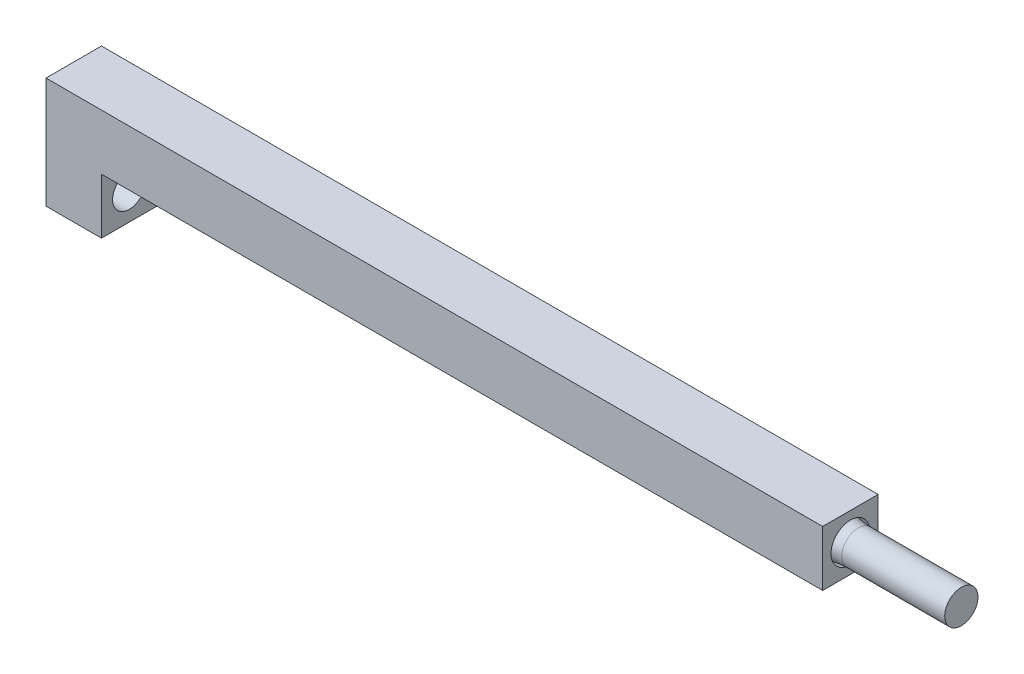
ISO-10303-21;
HEADER;
FILE_DESCRIPTION(('STEP AP214'),'2;1');
FILE_NAME('part.step','',(''),(''),'','','');
FILE_SCHEMA(('AUTOMOTIVE_DESIGN { 1 0 10303 214 1 1 1 1 }'));
ENDSEC;
DATA;
#1=APPLICATION_CONTEXT('core data for automotive mechanical design processes');
#2=APPLICATION_PROTOCOL_DEFINITION('international standard','automotive_design',2000,#1);
#3=PRODUCT_CONTEXT('',#1,'mechanical');
#4=PRODUCT('Part','Part','',(#3));
#5=PRODUCT_RELATED_PRODUCT_CATEGORY('part','',(#4));
#6=PRODUCT_DEFINITION_FORMATION('','',#4);
#7=PRODUCT_DEFINITION_CONTEXT('part definition',#1,'design');
#8=PRODUCT_DEFINITION('design','',#6,#7);
#9=PRODUCT_DEFINITION_SHAPE('','',#8);
#10=(LENGTH_UNIT() NAMED_UNIT(*) SI_UNIT(.MILLI.,.METRE.));
#11=(NAMED_UNIT(*) PLANE_ANGLE_UNIT() SI_UNIT($,.RADIAN.));
#12=(NAMED_UNIT(*) SI_UNIT($,.STERADIAN.) SOLID_ANGLE_UNIT());
#13=UNCERTAINTY_MEASURE_WITH_UNIT(LENGTH_MEASURE(1.E-05),#10,'distance_accuracy_value','');
#14=(GEOMETRIC_REPRESENTATION_CONTEXT(3) GLOBAL_UNCERTAINTY_ASSIGNED_CONTEXT((#13)) GLOBAL_UNIT_ASSIGNED_CONTEXT((#10,
#11,#12)) REPRESENTATION_CONTEXT('',''));
#15=CARTESIAN_POINT('',(0.,0.,0.));
#16=DIRECTION('',(0.,0.,1.));
#17=DIRECTION('',(1.,0.,0.));
#18=AXIS2_PLACEMENT_3D('',#15,#16,#17);
#19=CARTESIAN_POINT('',(-140.,10.,10.));
#20=DIRECTION('',(1.,0.,0.));
#21=DIRECTION('',(0.,1.,0.));
#22=AXIS2_PLACEMENT_3D('',#19,#20,#21);
#23=PLANE('',#22);
#24=CARTESIAN_POINT('',(-140.,-5.,5.));
#25=DIRECTION('',(1.,0.,0.));
#26=DIRECTION('',(0.,1.,0.));
#27=AXIS2_PLACEMENT_3D('',#24,#25,#26);
#28=CIRCLE('',#27,3.);
#29=CARTESIAN_POINT('',(-140.,-2.,5.));
#30=VERTEX_POINT('',#29);
#31=EDGE_CURVE('E137',#30,#30,#28,.T.);
#32=ORIENTED_EDGE('',*,*,#31,.T.);
#33=EDGE_LOOP('',(#32));
#34=FACE_BOUND('',#33,.T.);
#35=DIRECTION('',(0.,-1.,0.));
#36=VECTOR('',#35,1.);
#37=CARTESIAN_POINT('',(-140.,10.,0.));
#38=LINE('',#37,#36);
#39=CARTESIAN_POINT('',(-140.,10.,0.));
#40=VERTEX_POINT('',#39);
#41=CARTESIAN_POINT('',(-140.,-10.,0.));
#42=VERTEX_POINT('',#41);
#43=EDGE_CURVE('E132',#40,#42,#38,.T.);
#44=ORIENTED_EDGE('',*,*,#43,.T.);
#45=DIRECTION('',(0.,0.,-1.));
#46=VECTOR('',#45,1.);
#47=CARTESIAN_POINT('',(-140.,-10.,10.));
#48=LINE('',#47,#46);
#49=CARTESIAN_POINT('',(-140.,-10.,10.));
#50=VERTEX_POINT('',#49);
#51=EDGE_CURVE('E51',#50,#42,#48,.T.);
#52=ORIENTED_EDGE('',*,*,#51,.F.);
#53=DIRECTION('',(0.,-1.,0.));
#54=VECTOR('',#53,1.);
#55=CARTESIAN_POINT('',(-140.,10.,10.));
#56=LINE('',#55,#54);
#57=CARTESIAN_POINT('',(-140.,10.,10.));
#58=VERTEX_POINT('',#57);
#59=EDGE_CURVE('E149',#58,#50,#56,.T.);
#60=ORIENTED_EDGE('',*,*,#59,.F.);
#61=DIRECTION('',(0.,0.,-1.));
#62=VECTOR('',#61,1.);
#63=CARTESIAN_POINT('',(-140.,10.,10.));
#64=LINE('',#63,#62);
#65=EDGE_CURVE('E128',#58,#40,#64,.T.);
#66=ORIENTED_EDGE('',*,*,#65,.T.);
#67=EDGE_LOOP('',(#44,#52,#60,#66));
#68=FACE_BOUND('',#67,.T.);
#69=ADVANCED_FACE('F41',(#34,#68),#23,.F.);
#70=CARTESIAN_POINT('',(-140.,-10.,10.));
#71=DIRECTION('',(0.,1.,0.));
#72=DIRECTION('',(-1.,0.,0.));
#73=AXIS2_PLACEMENT_3D('',#70,#71,#72);
#74=PLANE('',#73);
#75=DIRECTION('',(1.,0.,0.));
#76=VECTOR('',#75,1.);
#77=CARTESIAN_POINT('',(-140.,-10.,0.));
#78=LINE('',#77,#76);
#79=CARTESIAN_POINT('',(-130.,-10.,0.));
#80=VERTEX_POINT('',#79);
#81=EDGE_CURVE('E136',#42,#80,#78,.T.);
#82=ORIENTED_EDGE('',*,*,#81,.T.);
#83=DIRECTION('',(0.,0.,-1.));
#84=VECTOR('',#83,1.);
#85=CARTESIAN_POINT('',(-130.,-10.,10.));
#86=LINE('',#85,#84);
#87=CARTESIAN_POINT('',(-130.,-10.,10.));
#88=VERTEX_POINT('',#87);
#89=EDGE_CURVE('E156',#88,#80,#86,.T.);
#90=ORIENTED_EDGE('',*,*,#89,.F.);
#91=DIRECTION('',(1.,0.,0.));
#92=VECTOR('',#91,1.);
#93=CARTESIAN_POINT('',(-140.,-10.,10.));
#94=LINE('',#93,#92);
#95=EDGE_CURVE('E97',#50,#88,#94,.T.);
#96=ORIENTED_EDGE('',*,*,#95,.F.);
#97=ORIENTED_EDGE('',*,*,#51,.T.);
#98=EDGE_LOOP('',(#82,#90,#96,#97));
#99=FACE_BOUND('',#98,.T.);
#100=ADVANCED_FACE('F188',(#99),#74,.F.);
#101=CARTESIAN_POINT('',(-130.,0.,10.));
#102=DIRECTION('',(-1.,0.,0.));
#103=DIRECTION('',(0.,0.,1.));
#104=AXIS2_PLACEMENT_3D('',#101,#102,#103);
#105=PLANE('',#104);
#106=CARTESIAN_POINT('',(-130.,-5.,5.));
#107=DIRECTION('',(-1.,0.,0.));
#108=DIRECTION('',(0.,0.,1.));
#109=AXIS2_PLACEMENT_3D('',#106,#107,#108);
#110=CIRCLE('',#109,3.);
#111=CARTESIAN_POINT('',(-130.,-5.,8.));
#112=VERTEX_POINT('',#111);
#113=EDGE_CURVE('E161',#112,#112,#110,.T.);
#114=ORIENTED_EDGE('',*,*,#113,.T.);
#115=EDGE_LOOP('',(#114));
#116=FACE_BOUND('',#115,.T.);
#117=DIRECTION('',(0.,1.,0.));
#118=VECTOR('',#117,1.);
#119=CARTESIAN_POINT('',(-130.,0.,0.));
#120=LINE('',#119,#118);
#121=CARTESIAN_POINT('',(-130.,0.,0.));
#122=VERTEX_POINT('',#121);
#123=EDGE_CURVE('E140',#80,#122,#120,.T.);
#124=ORIENTED_EDGE('',*,*,#123,.T.);
#125=DIRECTION('',(0.,0.,-1.));
#126=VECTOR('',#125,1.);
#127=CARTESIAN_POINT('',(-130.,0.,10.));
#128=LINE('',#127,#126);
#129=CARTESIAN_POINT('',(-130.,0.,10.));
#130=VERTEX_POINT('',#129);
#131=EDGE_CURVE('E121',#130,#122,#128,.T.);
#132=ORIENTED_EDGE('',*,*,#131,.F.);
#133=DIRECTION('',(0.,1.,0.));
#134=VECTOR('',#133,1.);
#135=CARTESIAN_POINT('',(-130.,0.,10.));
#136=LINE('',#135,#134);
#137=EDGE_CURVE('E110',#88,#130,#136,.T.);
#138=ORIENTED_EDGE('',*,*,#137,.F.);
#139=ORIENTED_EDGE('',*,*,#89,.T.);
#140=EDGE_LOOP('',(#124,#132,#138,#139));
#141=FACE_BOUND('',#140,.T.);
#142=ADVANCED_FACE('F191',(#116,#141),#105,.F.);
#143=CARTESIAN_POINT('',(-130.,0.,10.));
#144=DIRECTION('',(0.,1.,0.));
#145=DIRECTION('',(-1.,0.,0.));
#146=AXIS2_PLACEMENT_3D('',#143,#144,#145);
#147=PLANE('',#146);
#148=DIRECTION('',(1.,0.,0.));
#149=VECTOR('',#148,1.);
#150=CARTESIAN_POINT('',(-130.,0.,0.));
#151=LINE('',#150,#149);
#152=CARTESIAN_POINT('',(0.,3.6663897683068E-13,0.));
#153=VERTEX_POINT('',#152);
#154=EDGE_CURVE('E119',#122,#153,#151,.T.);
#155=ORIENTED_EDGE('',*,*,#154,.T.);
#156=DIRECTION('',(0.,0.,-1.));
#157=VECTOR('',#156,1.);
#158=CARTESIAN_POINT('',(0.,3.6663897683068E-13,10.));
#159=LINE('',#158,#157);
#160=CARTESIAN_POINT('',(0.,3.6663897683068E-13,10.));
#161=VERTEX_POINT('',#160);
#162=EDGE_CURVE('E116',#161,#153,#159,.T.);
#163=ORIENTED_EDGE('',*,*,#162,.F.);
#164=DIRECTION('',(1.,0.,0.));
#165=VECTOR('',#164,1.);
#166=CARTESIAN_POINT('',(-130.,0.,10.));
#167=LINE('',#166,#165);
#168=EDGE_CURVE('E104',#130,#161,#167,.T.);
#169=ORIENTED_EDGE('',*,*,#168,.F.);
#170=ORIENTED_EDGE('',*,*,#131,.T.);
#171=EDGE_LOOP('',(#155,#163,#169,#170));
#172=FACE_BOUND('',#171,.T.);
#173=ADVANCED_FACE('F117',(#172),#147,.F.);
#174=CARTESIAN_POINT('',(0.,10.,10.));
#175=DIRECTION('',(-1.,0.,0.));
#176=DIRECTION('',(0.,-1.,0.));
#177=AXIS2_PLACEMENT_3D('',#174,#175,#176);
#178=PLANE('',#177);
#179=CARTESIAN_POINT('',(0.,4.99999999999994,5.));
#180=DIRECTION('',(1.,0.,0.));
#181=DIRECTION('',(0.,1.,0.));
#182=AXIS2_PLACEMENT_3D('',#179,#180,#181);
#183=CIRCLE('',#182,3.5);
#184=CARTESIAN_POINT('',(0.,8.49999999999994,5.));
#185=VERTEX_POINT('',#184);
#186=EDGE_CURVE('E178',#185,#185,#183,.T.);
#187=ORIENTED_EDGE('',*,*,#186,.F.);
#188=EDGE_LOOP('',(#187));
#189=FACE_BOUND('',#188,.T.);
#190=DIRECTION('',(0.,1.,0.));
#191=VECTOR('',#190,1.);
#192=CARTESIAN_POINT('',(0.,10.,0.));
#193=LINE('',#192,#191);
#194=CARTESIAN_POINT('',(0.,10.,0.));
#195=VERTEX_POINT('',#194);
#196=EDGE_CURVE('E82',#153,#195,#193,.T.);
#197=ORIENTED_EDGE('',*,*,#196,.T.);
#198=DIRECTION('',(0.,0.,-1.));
#199=VECTOR('',#198,1.);
#200=CARTESIAN_POINT('',(0.,10.,10.));
#201=LINE('',#200,#199);
#202=CARTESIAN_POINT('',(0.,10.,10.));
#203=VERTEX_POINT('',#202);
#204=EDGE_CURVE('E122',#203,#195,#201,.T.);
#205=ORIENTED_EDGE('',*,*,#204,.F.);
#206=DIRECTION('',(0.,1.,0.));
#207=VECTOR('',#206,1.);
#208=CARTESIAN_POINT('',(0.,10.,10.));
#209=LINE('',#208,#207);
#210=EDGE_CURVE('E108',#161,#203,#209,.T.);
#211=ORIENTED_EDGE('',*,*,#210,.F.);
#212=ORIENTED_EDGE('',*,*,#162,.T.);
#213=EDGE_LOOP('',(#197,#205,#211,#212));
#214=FACE_BOUND('',#213,.T.);
#215=ADVANCED_FACE('F124',(#189,#214),#178,.F.);
#216=CARTESIAN_POINT('',(-140.,10.,10.));
#217=DIRECTION('',(0.,-1.,0.));
#218=DIRECTION('',(0.,0.,-1.));
#219=AXIS2_PLACEMENT_3D('',#216,#217,#218);
#220=PLANE('',#219);
#221=DIRECTION('',(-1.,0.,0.));
#222=VECTOR('',#221,1.);
#223=CARTESIAN_POINT('',(-140.,10.,0.));
#224=LINE('',#223,#222);
#225=EDGE_CURVE('E88',#195,#40,#224,.T.);
#226=ORIENTED_EDGE('',*,*,#225,.T.);
#227=ORIENTED_EDGE('',*,*,#65,.F.);
#228=DIRECTION('',(-1.,0.,0.));
#229=VECTOR('',#228,1.);
#230=CARTESIAN_POINT('',(-140.,10.,10.));
#231=LINE('',#230,#229);
#232=EDGE_CURVE('E59',#203,#58,#231,.T.);
#233=ORIENTED_EDGE('',*,*,#232,.F.);
#234=ORIENTED_EDGE('',*,*,#204,.T.);
#235=EDGE_LOOP('',(#226,#227,#233,#234));
#236=FACE_BOUND('',#235,.T.);
#237=ADVANCED_FACE('F196',(#236),#220,.F.);
#238=CARTESIAN_POINT('',(0.,0.,10.));
#239=DIRECTION('',(0.,0.,1.));
#240=DIRECTION('',(1.,0.,0.));
#241=AXIS2_PLACEMENT_3D('',#238,#239,#240);
#242=PLANE('',#241);
#243=ORIENTED_EDGE('',*,*,#59,.T.);
#244=ORIENTED_EDGE('',*,*,#95,.T.);
#245=ORIENTED_EDGE('',*,*,#137,.T.);
#246=ORIENTED_EDGE('',*,*,#168,.T.);
#247=ORIENTED_EDGE('',*,*,#210,.T.);
#248=ORIENTED_EDGE('',*,*,#232,.T.);
#249=EDGE_LOOP('',(#243,#244,#245,#246,#247,#248));
#250=FACE_BOUND('',#249,.T.);
#251=ADVANCED_FACE('F106',(#250),#242,.T.);
#252=CARTESIAN_POINT('',(0.,0.,0.));
#253=DIRECTION('',(0.,0.,1.));
#254=DIRECTION('',(1.,0.,0.));
#255=AXIS2_PLACEMENT_3D('',#252,#253,#254);
#256=PLANE('',#255);
#257=ORIENTED_EDGE('',*,*,#43,.F.);
#258=ORIENTED_EDGE('',*,*,#225,.F.);
#259=ORIENTED_EDGE('',*,*,#196,.F.);
#260=ORIENTED_EDGE('',*,*,#154,.F.);
#261=ORIENTED_EDGE('',*,*,#123,.F.);
#262=ORIENTED_EDGE('',*,*,#81,.F.);
#263=EDGE_LOOP('',(#257,#258,#259,#260,#261,#262));
#264=FACE_BOUND('',#263,.T.);
#265=ADVANCED_FACE('F194',(#264),#256,.F.);
#266=CARTESIAN_POINT('',(-150.,-5.,5.));
#267=DIRECTION('',(1.,0.,0.));
#268=DIRECTION('',(0.,0.,-1.));
#269=AXIS2_PLACEMENT_3D('',#266,#267,#268);
#270=CYLINDRICAL_SURFACE('',#269,3.);
#271=ORIENTED_EDGE('',*,*,#113,.F.);
#272=EDGE_LOOP('',(#271));
#273=FACE_BOUND('',#272,.T.);
#274=ORIENTED_EDGE('',*,*,#31,.F.);
#275=EDGE_LOOP('',(#274));
#276=FACE_BOUND('',#275,.T.);
#277=ADVANCED_FACE('F243',(#273,#276),#270,.F.);
#278=CARTESIAN_POINT('',(-2.00000000000001,4.99999999999994,5.));
#279=DIRECTION('',(1.,0.,0.));
#280=DIRECTION('',(0.,1.,0.));
#281=AXIS2_PLACEMENT_3D('',#278,#279,#280);
#282=CYLINDRICAL_SURFACE('',#281,3.5);
#283=CARTESIAN_POINT('',(-2.00000000000001,4.99999999999994,5.));
#284=DIRECTION('',(1.,0.,0.));
#285=DIRECTION('',(0.,1.,0.));
#286=AXIS2_PLACEMENT_3D('',#283,#284,#285);
#287=CIRCLE('',#286,3.5);
#288=CARTESIAN_POINT('',(-2.00000000000002,8.49999999999994,5.));
#289=VERTEX_POINT('',#288);
#290=EDGE_CURVE('E172',#289,#289,#287,.T.);
#291=ORIENTED_EDGE('',*,*,#290,.F.);
#292=EDGE_LOOP('',(#291));
#293=FACE_BOUND('',#292,.T.);
#294=ORIENTED_EDGE('',*,*,#186,.T.);
#295=EDGE_LOOP('',(#294));
#296=FACE_BOUND('',#295,.T.);
#297=ADVANCED_FACE('F238',(#293,#296),#282,.F.);
#298=CARTESIAN_POINT('',(20.,5.,5.));
#299=DIRECTION('',(1.,0.,0.));
#300=DIRECTION('',(0.,0.,-1.));
#301=AXIS2_PLACEMENT_3D('',#298,#299,#300);
#302=PLANE('',#301);
#303=CARTESIAN_POINT('',(20.,5.,5.));
#304=DIRECTION('',(1.,0.,0.));
#305=DIRECTION('',(0.,0.,-1.));
#306=AXIS2_PLACEMENT_3D('',#303,#304,#305);
#307=CIRCLE('',#306,3.);
#308=CARTESIAN_POINT('',(20.,5.,2.));
#309=VERTEX_POINT('',#308);
#310=EDGE_CURVE('E164',#309,#309,#307,.T.);
#311=ORIENTED_EDGE('',*,*,#310,.T.);
#312=EDGE_LOOP('',(#311));
#313=FACE_BOUND('',#312,.T.);
#314=ADVANCED_FACE('F233',(#313),#302,.T.);
#315=CARTESIAN_POINT('',(20.,5.,5.));
#316=DIRECTION('',(-1.,0.,0.));
#317=DIRECTION('',(0.,0.,1.));
#318=AXIS2_PLACEMENT_3D('',#315,#316,#317);
#319=CYLINDRICAL_SURFACE('',#318,3.);
#320=CARTESIAN_POINT('',(1.42782730020048,5.,5.));
#321=DIRECTION('',(-1.,0.,0.));
#322=DIRECTION('',(0.,-1.,0.));
#323=AXIS2_PLACEMENT_3D('',#320,#321,#322);
#324=CIRCLE('',#323,3.);
#325=CARTESIAN_POINT('',(1.42782730020048,2.,5.));
#326=VERTEX_POINT('',#325);
#327=EDGE_CURVE('E11',#326,#326,#324,.F.);
#328=ORIENTED_EDGE('',*,*,#327,.T.);
#329=EDGE_LOOP('',(#328));
#330=FACE_BOUND('',#329,.T.);
#331=ORIENTED_EDGE('',*,*,#310,.F.);
#332=EDGE_LOOP('',(#331));
#333=FACE_BOUND('',#332,.T.);
#334=ADVANCED_FACE('F251',(#330,#333),#319,.T.);
#335=CARTESIAN_POINT('',(1.42782730020051,4.99999999999995,5.));
#336=DIRECTION('',(-1.,0.,0.));
#337=DIRECTION('',(0.,-1.,0.));
#338=AXIS2_PLACEMENT_3D('',#335,#336,#337);
#339=TOROIDAL_SURFACE('',#338,15.,12.);
#340=ORIENTED_EDGE('',*,*,#290,.T.);
#341=EDGE_LOOP('',(#340));
#342=FACE_BOUND('',#341,.T.);
#343=ORIENTED_EDGE('',*,*,#327,.F.);
#344=EDGE_LOOP('',(#343));
#345=FACE_BOUND('',#344,.T.);
#346=ADVANCED_FACE('F43',(#342,#345),#339,.F.);
#347=CLOSED_SHELL('',(#69,#100,#142,#173,#215,#237,#251,#265,#277,#297,#314,#334,#346));
#348=MANIFOLD_SOLID_BREP('B2',#347);
#349=ADVANCED_BREP_SHAPE_REPRESENTATION('',(#18,#348),#14);
#350=SHAPE_DEFINITION_REPRESENTATION(#9,#349);
ENDSEC;
END-ISO-10303-21;
